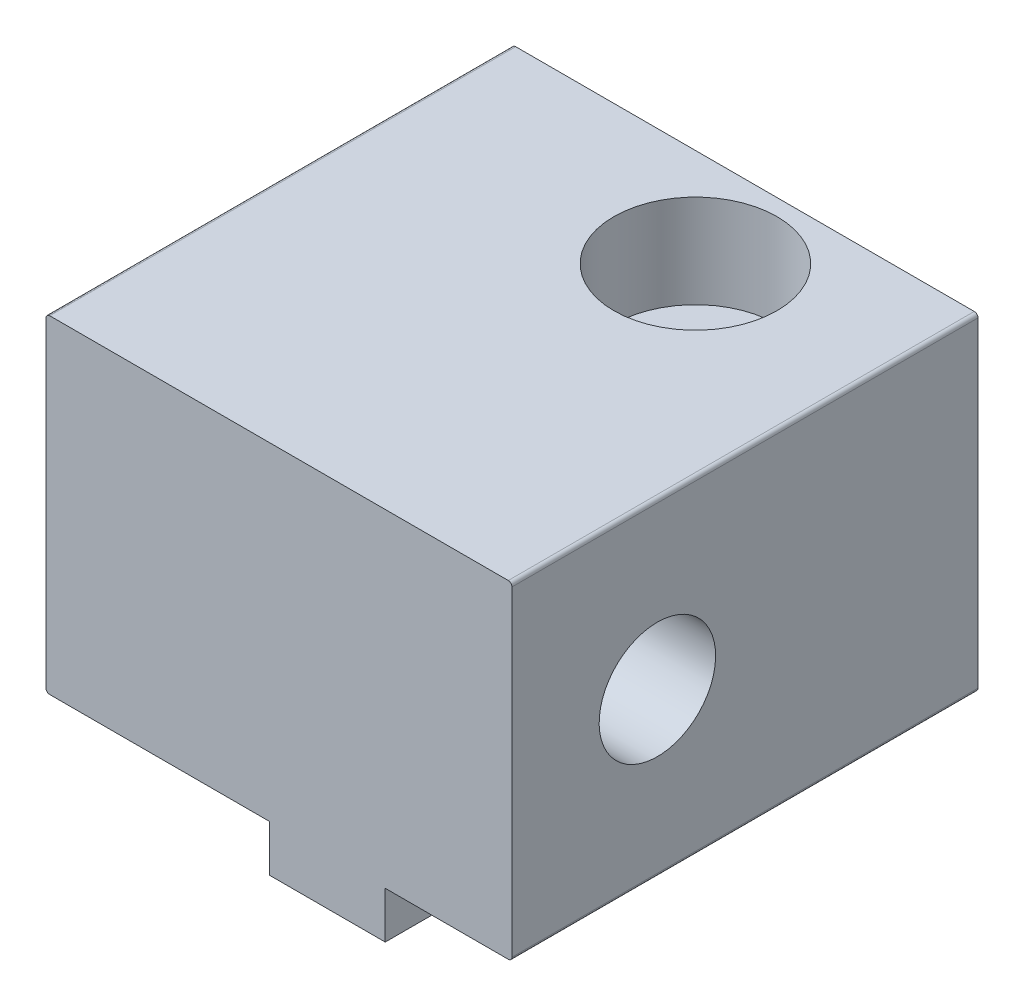
ISO-10303-21;
HEADER;
FILE_DESCRIPTION(('STEP AP214'),'2;1');
FILE_NAME('part.step','',(''),(''),'','','');
FILE_SCHEMA(('AUTOMOTIVE_DESIGN { 1 0 10303 214 1 1 1 1 }'));
ENDSEC;
DATA;
#1=APPLICATION_CONTEXT('core data for automotive mechanical design processes');
#2=APPLICATION_PROTOCOL_DEFINITION('international standard','automotive_design',2000,#1);
#3=PRODUCT_CONTEXT('',#1,'mechanical');
#4=PRODUCT('Part','Part','',(#3));
#5=PRODUCT_RELATED_PRODUCT_CATEGORY('part','',(#4));
#6=PRODUCT_DEFINITION_FORMATION('','',#4);
#7=PRODUCT_DEFINITION_CONTEXT('part definition',#1,'design');
#8=PRODUCT_DEFINITION('design','',#6,#7);
#9=PRODUCT_DEFINITION_SHAPE('','',#8);
#10=(LENGTH_UNIT() NAMED_UNIT(*) SI_UNIT(.MILLI.,.METRE.));
#11=(NAMED_UNIT(*) PLANE_ANGLE_UNIT() SI_UNIT($,.RADIAN.));
#12=(NAMED_UNIT(*) SI_UNIT($,.STERADIAN.) SOLID_ANGLE_UNIT());
#13=UNCERTAINTY_MEASURE_WITH_UNIT(LENGTH_MEASURE(1.E-05),#10,'distance_accuracy_value','');
#14=(GEOMETRIC_REPRESENTATION_CONTEXT(3) GLOBAL_UNCERTAINTY_ASSIGNED_CONTEXT((#13)) GLOBAL_UNIT_ASSIGNED_CONTEXT((#10,
#11,#12)) REPRESENTATION_CONTEXT('',''));
#15=CARTESIAN_POINT('',(0.,0.,0.));
#16=DIRECTION('',(0.,0.,1.));
#17=DIRECTION('',(1.,0.,0.));
#18=AXIS2_PLACEMENT_3D('',#15,#16,#17);
#19=CARTESIAN_POINT('',(-37.8626168224299,27.8474205607477,31.75));
#20=DIRECTION('',(1.,0.,0.));
#21=DIRECTION('',(0.,0.,-1.));
#22=AXIS2_PLACEMENT_3D('',#19,#20,#21);
#23=PLANE('',#22);
#24=CARTESIAN_POINT('',(-37.8626168224299,16.5952205607476,21.844));
#25=DIRECTION('',(1.,0.,0.));
#26=DIRECTION('',(0.,1.,0.));
#27=AXIS2_PLACEMENT_3D('',#24,#25,#26);
#28=CIRCLE('',#27,3.96875);
#29=CARTESIAN_POINT('',(-37.8626168224299,20.5639705607476,21.844));
#30=VERTEX_POINT('',#29);
#31=EDGE_CURVE('E241',#30,#30,#28,.T.);
#32=ORIENTED_EDGE('',*,*,#31,.T.);
#33=EDGE_LOOP('',(#32));
#34=FACE_BOUND('',#33,.T.);
#35=DIRECTION('',(0.,-1.,0.));
#36=VECTOR('',#35,1.);
#37=CARTESIAN_POINT('',(-37.8626168224299,27.8474205607477,0.));
#38=LINE('',#37,#36);
#39=CARTESIAN_POINT('',(-37.8626168224299,27.5934205607476,0.));
#40=VERTEX_POINT('',#39);
#41=CARTESIAN_POINT('',(-37.8626168224299,5.74942056074767,0.));
#42=VERTEX_POINT('',#41);
#43=EDGE_CURVE('E146',#40,#42,#38,.T.);
#44=ORIENTED_EDGE('',*,*,#43,.T.);
#45=DIRECTION('',(0.,0.,-1.));
#46=VECTOR('',#45,1.);
#47=CARTESIAN_POINT('',(-37.8626168224299,5.74942056074767,31.75));
#48=LINE('',#47,#46);
#49=CARTESIAN_POINT('',(-37.8626168224299,5.74942056074767,31.75));
#50=VERTEX_POINT('',#49);
#51=EDGE_CURVE('E183',#42,#50,#48,.F.);
#52=ORIENTED_EDGE('',*,*,#51,.T.);
#53=DIRECTION('',(0.,-1.,0.));
#54=VECTOR('',#53,1.);
#55=CARTESIAN_POINT('',(-37.8626168224299,27.8474205607477,31.75));
#56=LINE('',#55,#54);
#57=CARTESIAN_POINT('',(-37.8626168224299,27.5934205607476,31.75));
#58=VERTEX_POINT('',#57);
#59=EDGE_CURVE('E116',#58,#50,#56,.T.);
#60=ORIENTED_EDGE('',*,*,#59,.F.);
#61=DIRECTION('',(0.,0.,-1.));
#62=VECTOR('',#61,1.);
#63=CARTESIAN_POINT('',(-37.8626168224299,27.5934205607476,31.75));
#64=LINE('',#63,#62);
#65=EDGE_CURVE('E180',#58,#40,#64,.T.);
#66=ORIENTED_EDGE('',*,*,#65,.T.);
#67=EDGE_LOOP('',(#44,#52,#60,#66));
#68=FACE_BOUND('',#67,.T.);
#69=ADVANCED_FACE('F16',(#34,#68),#23,.F.);
#70=CARTESIAN_POINT('',(-37.8626168224299,5.49542056074766,31.75));
#71=DIRECTION('',(0.,1.,0.));
#72=DIRECTION('',(-1.,0.,0.));
#73=AXIS2_PLACEMENT_3D('',#70,#71,#72);
#74=PLANE('',#73);
#75=DIRECTION('',(1.,0.,0.));
#76=VECTOR('',#75,1.);
#77=CARTESIAN_POINT('',(-37.8626168224299,5.49542056074766,31.75));
#78=LINE('',#77,#76);
#79=CARTESIAN_POINT('',(-37.6086168224299,5.49542056074766,31.75));
#80=VERTEX_POINT('',#79);
#81=CARTESIAN_POINT('',(-22.6226168224299,5.49542056074767,31.75));
#82=VERTEX_POINT('',#81);
#83=EDGE_CURVE('E104',#80,#82,#78,.T.);
#84=ORIENTED_EDGE('',*,*,#83,.F.);
#85=DIRECTION('',(0.,0.,-1.));
#86=VECTOR('',#85,1.);
#87=CARTESIAN_POINT('',(-37.6086168224299,5.49542056074766,31.75));
#88=LINE('',#87,#86);
#89=CARTESIAN_POINT('',(-37.6086168224299,5.49542056074766,0.));
#90=VERTEX_POINT('',#89);
#91=EDGE_CURVE('E125',#80,#90,#88,.T.);
#92=ORIENTED_EDGE('',*,*,#91,.T.);
#93=DIRECTION('',(1.,0.,0.));
#94=VECTOR('',#93,1.);
#95=CARTESIAN_POINT('',(-37.8626168224299,5.49542056074766,0.));
#96=LINE('',#95,#94);
#97=CARTESIAN_POINT('',(-22.6226168224299,5.49542056074767,0.));
#98=VERTEX_POINT('',#97);
#99=EDGE_CURVE('E122',#90,#98,#96,.T.);
#100=ORIENTED_EDGE('',*,*,#99,.T.);
#101=DIRECTION('',(0.,0.,-1.));
#102=VECTOR('',#101,1.);
#103=CARTESIAN_POINT('',(-22.6226168224299,5.49542056074767,31.75));
#104=LINE('',#103,#102);
#105=EDGE_CURVE('E119',#82,#98,#104,.T.);
#106=ORIENTED_EDGE('',*,*,#105,.F.);
#107=EDGE_LOOP('',(#84,#92,#100,#106));
#108=FACE_BOUND('',#107,.T.);
#109=ADVANCED_FACE('F120',(#108),#74,.F.);
#110=CARTESIAN_POINT('',(-22.6226168224299,5.49542056074767,31.75));
#111=DIRECTION('',(1.,0.,0.));
#112=DIRECTION('',(0.,0.,-1.));
#113=AXIS2_PLACEMENT_3D('',#110,#111,#112);
#114=PLANE('',#113);
#115=DIRECTION('',(0.,-1.,0.));
#116=VECTOR('',#115,1.);
#117=CARTESIAN_POINT('',(-22.6226168224299,5.49542056074767,0.));
#118=LINE('',#117,#116);
#119=CARTESIAN_POINT('',(-22.6226168224299,2.32042056074767,0.));
#120=VERTEX_POINT('',#119);
#121=EDGE_CURVE('E151',#98,#120,#118,.T.);
#122=ORIENTED_EDGE('',*,*,#121,.T.);
#123=DIRECTION('',(0.,0.,-1.));
#124=VECTOR('',#123,1.);
#125=CARTESIAN_POINT('',(-22.6226168224299,2.32042056074767,31.75));
#126=LINE('',#125,#124);
#127=CARTESIAN_POINT('',(-22.6226168224299,2.32042056074767,31.75));
#128=VERTEX_POINT('',#127);
#129=EDGE_CURVE('E126',#128,#120,#126,.T.);
#130=ORIENTED_EDGE('',*,*,#129,.F.);
#131=DIRECTION('',(0.,-1.,0.));
#132=VECTOR('',#131,1.);
#133=CARTESIAN_POINT('',(-22.6226168224299,5.49542056074767,31.75));
#134=LINE('',#133,#132);
#135=EDGE_CURVE('E109',#82,#128,#134,.T.);
#136=ORIENTED_EDGE('',*,*,#135,.F.);
#137=ORIENTED_EDGE('',*,*,#105,.T.);
#138=EDGE_LOOP('',(#122,#130,#136,#137));
#139=FACE_BOUND('',#138,.T.);
#140=ADVANCED_FACE('F128',(#139),#114,.F.);
#141=CARTESIAN_POINT('',(-22.6226168224299,2.32042056074767,31.75));
#142=DIRECTION('',(0.,1.,0.));
#143=DIRECTION('',(0.,0.,1.));
#144=AXIS2_PLACEMENT_3D('',#141,#142,#143);
#145=PLANE('',#144);
#146=CARTESIAN_POINT('',(-18.6856168224299,2.32042056074767,6.6802));
#147=DIRECTION('',(0.,1.,0.));
#148=DIRECTION('',(0.,0.,1.));
#149=AXIS2_PLACEMENT_3D('',#146,#147,#148);
#150=CIRCLE('',#149,3.2639);
#151=CARTESIAN_POINT('',(-18.6856168224299,2.32042056074767,9.9441));
#152=VERTEX_POINT('',#151);
#153=EDGE_CURVE('E238',#152,#152,#150,.T.);
#154=ORIENTED_EDGE('',*,*,#153,.T.);
#155=EDGE_LOOP('',(#154));
#156=FACE_BOUND('',#155,.T.);
#157=DIRECTION('',(1.,0.,0.));
#158=VECTOR('',#157,1.);
#159=CARTESIAN_POINT('',(-22.6226168224299,2.32042056074767,0.));
#160=LINE('',#159,#158);
#161=CARTESIAN_POINT('',(-14.7486168224299,2.32042056074767,0.));
#162=VERTEX_POINT('',#161);
#163=EDGE_CURVE('E153',#120,#162,#160,.T.);
#164=ORIENTED_EDGE('',*,*,#163,.T.);
#165=DIRECTION('',(0.,0.,-1.));
#166=VECTOR('',#165,1.);
#167=CARTESIAN_POINT('',(-14.7486168224299,2.32042056074767,31.75));
#168=LINE('',#167,#166);
#169=CARTESIAN_POINT('',(-14.7486168224299,2.32042056074767,31.75));
#170=VERTEX_POINT('',#169);
#171=EDGE_CURVE('E167',#170,#162,#168,.T.);
#172=ORIENTED_EDGE('',*,*,#171,.F.);
#173=DIRECTION('',(1.,0.,0.));
#174=VECTOR('',#173,1.);
#175=CARTESIAN_POINT('',(-22.6226168224299,2.32042056074767,31.75));
#176=LINE('',#175,#174);
#177=EDGE_CURVE('E131',#128,#170,#176,.T.);
#178=ORIENTED_EDGE('',*,*,#177,.F.);
#179=ORIENTED_EDGE('',*,*,#129,.T.);
#180=EDGE_LOOP('',(#164,#172,#178,#179));
#181=FACE_BOUND('',#180,.T.);
#182=ADVANCED_FACE('F386',(#156,#181),#145,.F.);
#183=CARTESIAN_POINT('',(-14.7486168224299,5.49542056074767,31.75));
#184=DIRECTION('',(-1.,0.,0.));
#185=DIRECTION('',(0.,-1.,0.));
#186=AXIS2_PLACEMENT_3D('',#183,#184,#185);
#187=PLANE('',#186);
#188=DIRECTION('',(0.,1.,0.));
#189=VECTOR('',#188,1.);
#190=CARTESIAN_POINT('',(-14.7486168224299,5.49542056074767,0.));
#191=LINE('',#190,#189);
#192=CARTESIAN_POINT('',(-14.7486168224299,5.49542056074767,0.));
#193=VERTEX_POINT('',#192);
#194=EDGE_CURVE('E155',#162,#193,#191,.T.);
#195=ORIENTED_EDGE('',*,*,#194,.T.);
#196=DIRECTION('',(0.,0.,-1.));
#197=VECTOR('',#196,1.);
#198=CARTESIAN_POINT('',(-14.7486168224299,5.49542056074767,31.75));
#199=LINE('',#198,#197);
#200=CARTESIAN_POINT('',(-14.7486168224299,5.49542056074767,31.75));
#201=VERTEX_POINT('',#200);
#202=EDGE_CURVE('E145',#201,#193,#199,.T.);
#203=ORIENTED_EDGE('',*,*,#202,.F.);
#204=DIRECTION('',(0.,1.,0.));
#205=VECTOR('',#204,1.);
#206=CARTESIAN_POINT('',(-14.7486168224299,5.49542056074767,31.75));
#207=LINE('',#206,#205);
#208=EDGE_CURVE('E133',#170,#201,#207,.T.);
#209=ORIENTED_EDGE('',*,*,#208,.F.);
#210=ORIENTED_EDGE('',*,*,#171,.T.);
#211=EDGE_LOOP('',(#195,#203,#209,#210));
#212=FACE_BOUND('',#211,.T.);
#213=ADVANCED_FACE('F266',(#212),#187,.F.);
#214=CARTESIAN_POINT('',(-14.7486168224299,5.49542056074767,31.75));
#215=DIRECTION('',(0.,1.,0.));
#216=DIRECTION('',(-1.,0.,0.));
#217=AXIS2_PLACEMENT_3D('',#214,#215,#216);
#218=PLANE('',#217);
#219=DIRECTION('',(1.,0.,0.));
#220=VECTOR('',#219,1.);
#221=CARTESIAN_POINT('',(-14.7486168224299,5.49542056074767,0.));
#222=LINE('',#221,#220);
#223=CARTESIAN_POINT('',(-6.3666168224299,5.49542056074766,0.));
#224=VERTEX_POINT('',#223);
#225=EDGE_CURVE('E157',#193,#224,#222,.T.);
#226=ORIENTED_EDGE('',*,*,#225,.T.);
#227=DIRECTION('',(0.,0.,-1.));
#228=VECTOR('',#227,1.);
#229=CARTESIAN_POINT('',(-6.3666168224299,5.49542056074766,31.75));
#230=LINE('',#229,#228);
#231=CARTESIAN_POINT('',(-6.3666168224299,5.49542056074766,31.75));
#232=VERTEX_POINT('',#231);
#233=EDGE_CURVE('E196',#224,#232,#230,.F.);
#234=ORIENTED_EDGE('',*,*,#233,.T.);
#235=DIRECTION('',(1.,0.,0.));
#236=VECTOR('',#235,1.);
#237=CARTESIAN_POINT('',(-14.7486168224299,5.49542056074767,31.75));
#238=LINE('',#237,#236);
#239=EDGE_CURVE('E138',#201,#232,#238,.T.);
#240=ORIENTED_EDGE('',*,*,#239,.F.);
#241=ORIENTED_EDGE('',*,*,#202,.T.);
#242=EDGE_LOOP('',(#226,#234,#240,#241));
#243=FACE_BOUND('',#242,.T.);
#244=ADVANCED_FACE('F200',(#243),#218,.F.);
#245=CARTESIAN_POINT('',(-6.1126168224299,27.8474205607477,31.75));
#246=DIRECTION('',(-1.,0.,0.));
#247=DIRECTION('',(0.,0.,1.));
#248=AXIS2_PLACEMENT_3D('',#245,#246,#247);
#249=PLANE('',#248);
#250=CARTESIAN_POINT('',(-6.11261682242991,16.5952205607476,21.844));
#251=DIRECTION('',(1.,0.,0.));
#252=DIRECTION('',(0.,1.,0.));
#253=AXIS2_PLACEMENT_3D('',#250,#251,#252);
#254=CIRCLE('',#253,3.96875);
#255=CARTESIAN_POINT('',(-6.11261682242991,20.5639705607476,21.844));
#256=VERTEX_POINT('',#255);
#257=EDGE_CURVE('E242',#256,#256,#254,.T.);
#258=ORIENTED_EDGE('',*,*,#257,.F.);
#259=EDGE_LOOP('',(#258));
#260=FACE_BOUND('',#259,.T.);
#261=DIRECTION('',(0.,1.,0.));
#262=VECTOR('',#261,1.);
#263=CARTESIAN_POINT('',(-6.1126168224299,27.8474205607477,31.75));
#264=LINE('',#263,#262);
#265=CARTESIAN_POINT('',(-6.1126168224299,5.74942056074767,31.75));
#266=VERTEX_POINT('',#265);
#267=CARTESIAN_POINT('',(-6.1126168224299,27.5934205607476,31.75));
#268=VERTEX_POINT('',#267);
#269=EDGE_CURVE('E141',#266,#268,#264,.T.);
#270=ORIENTED_EDGE('',*,*,#269,.F.);
#271=DIRECTION('',(0.,0.,-1.));
#272=VECTOR('',#271,1.);
#273=CARTESIAN_POINT('',(-6.1126168224299,5.74942056074767,31.75));
#274=LINE('',#273,#272);
#275=CARTESIAN_POINT('',(-6.1126168224299,5.74942056074767,0.));
#276=VERTEX_POINT('',#275);
#277=EDGE_CURVE('E193',#266,#276,#274,.T.);
#278=ORIENTED_EDGE('',*,*,#277,.T.);
#279=DIRECTION('',(0.,1.,0.));
#280=VECTOR('',#279,1.);
#281=CARTESIAN_POINT('',(-6.1126168224299,27.8474205607477,0.));
#282=LINE('',#281,#280);
#283=CARTESIAN_POINT('',(-6.1126168224299,27.5934205607476,0.));
#284=VERTEX_POINT('',#283);
#285=EDGE_CURVE('E160',#276,#284,#282,.T.);
#286=ORIENTED_EDGE('',*,*,#285,.T.);
#287=DIRECTION('',(0.,0.,-1.));
#288=VECTOR('',#287,1.);
#289=CARTESIAN_POINT('',(-6.1126168224299,27.5934205607476,31.75));
#290=LINE('',#289,#288);
#291=EDGE_CURVE('E191',#284,#268,#290,.F.);
#292=ORIENTED_EDGE('',*,*,#291,.T.);
#293=EDGE_LOOP('',(#270,#278,#286,#292));
#294=FACE_BOUND('',#293,.T.);
#295=ADVANCED_FACE('F211',(#260,#294),#249,.F.);
#296=CARTESIAN_POINT('',(-37.8626168224299,27.8474205607477,31.75));
#297=DIRECTION('',(0.,-1.,0.));
#298=DIRECTION('',(0.,0.,-1.));
#299=AXIS2_PLACEMENT_3D('',#296,#297,#298);
#300=PLANE('',#299);
#301=CARTESIAN_POINT('',(-18.6856168224299,27.8474205607477,6.6802));
#302=DIRECTION('',(0.,1.,0.));
#303=DIRECTION('',(0.,0.,1.));
#304=AXIS2_PLACEMENT_3D('',#301,#302,#303);
#305=CIRCLE('',#304,5.55625);
#306=CARTESIAN_POINT('',(-18.6856168224299,27.8474205607477,12.23645));
#307=VERTEX_POINT('',#306);
#308=EDGE_CURVE('E149',#307,#307,#305,.T.);
#309=ORIENTED_EDGE('',*,*,#308,.F.);
#310=EDGE_LOOP('',(#309));
#311=FACE_BOUND('',#310,.T.);
#312=DIRECTION('',(-1.,0.,0.));
#313=VECTOR('',#312,1.);
#314=CARTESIAN_POINT('',(-37.8626168224299,27.8474205607477,31.75));
#315=LINE('',#314,#313);
#316=CARTESIAN_POINT('',(-6.3666168224299,27.8474205607477,31.75));
#317=VERTEX_POINT('',#316);
#318=CARTESIAN_POINT('',(-37.6086168224299,27.8474205607477,31.75));
#319=VERTEX_POINT('',#318);
#320=EDGE_CURVE('E143',#317,#319,#315,.T.);
#321=ORIENTED_EDGE('',*,*,#320,.F.);
#322=DIRECTION('',(0.,0.,-1.));
#323=VECTOR('',#322,1.);
#324=CARTESIAN_POINT('',(-6.3666168224299,27.8474205607477,31.75));
#325=LINE('',#324,#323);
#326=CARTESIAN_POINT('',(-6.3666168224299,27.8474205607477,0.));
#327=VERTEX_POINT('',#326);
#328=EDGE_CURVE('E10',#317,#327,#325,.T.);
#329=ORIENTED_EDGE('',*,*,#328,.T.);
#330=DIRECTION('',(-1.,0.,0.));
#331=VECTOR('',#330,1.);
#332=CARTESIAN_POINT('',(-37.8626168224299,27.8474205607477,0.));
#333=LINE('',#332,#331);
#334=CARTESIAN_POINT('',(-37.6086168224299,27.8474205607477,0.));
#335=VERTEX_POINT('',#334);
#336=EDGE_CURVE('E163',#327,#335,#333,.T.);
#337=ORIENTED_EDGE('',*,*,#336,.T.);
#338=DIRECTION('',(0.,0.,-1.));
#339=VECTOR('',#338,1.);
#340=CARTESIAN_POINT('',(-37.6086168224299,27.8474205607477,31.75));
#341=LINE('',#340,#339);
#342=EDGE_CURVE('E24',#335,#319,#341,.F.);
#343=ORIENTED_EDGE('',*,*,#342,.T.);
#344=EDGE_LOOP('',(#321,#329,#337,#343));
#345=FACE_BOUND('',#344,.T.);
#346=ADVANCED_FACE('F219',(#311,#345),#300,.F.);
#347=CARTESIAN_POINT('',(-37.8626168224299,2.32042056074767,31.75));
#348=DIRECTION('',(0.,0.,1.));
#349=DIRECTION('',(1.,0.,0.));
#350=AXIS2_PLACEMENT_3D('',#347,#348,#349);
#351=PLANE('',#350);
#352=ORIENTED_EDGE('',*,*,#59,.T.);
#353=CARTESIAN_POINT('',(-37.6086168224299,5.74942056074766,31.75));
#354=DIRECTION('',(0.,0.,1.));
#355=DIRECTION('',(1.,0.,0.));
#356=AXIS2_PLACEMENT_3D('',#353,#354,#355);
#357=CIRCLE('',#356,0.254);
#358=EDGE_CURVE('E112',#50,#80,#357,.T.);
#359=ORIENTED_EDGE('',*,*,#358,.T.);
#360=ORIENTED_EDGE('',*,*,#83,.T.);
#361=ORIENTED_EDGE('',*,*,#135,.T.);
#362=ORIENTED_EDGE('',*,*,#177,.T.);
#363=ORIENTED_EDGE('',*,*,#208,.T.);
#364=ORIENTED_EDGE('',*,*,#239,.T.);
#365=CARTESIAN_POINT('',(-6.3666168224299,5.74942056074767,31.75));
#366=DIRECTION('',(0.,0.,1.));
#367=DIRECTION('',(1.,0.,0.));
#368=AXIS2_PLACEMENT_3D('',#365,#366,#367);
#369=CIRCLE('',#368,0.254);
#370=EDGE_CURVE('E188',#232,#266,#369,.T.);
#371=ORIENTED_EDGE('',*,*,#370,.T.);
#372=ORIENTED_EDGE('',*,*,#269,.T.);
#373=CARTESIAN_POINT('',(-6.3666168224299,27.5934205607476,31.75));
#374=DIRECTION('',(0.,0.,1.));
#375=DIRECTION('',(1.,0.,0.));
#376=AXIS2_PLACEMENT_3D('',#373,#374,#375);
#377=CIRCLE('',#376,0.254);
#378=EDGE_CURVE('E37',#268,#317,#377,.T.);
#379=ORIENTED_EDGE('',*,*,#378,.T.);
#380=ORIENTED_EDGE('',*,*,#320,.T.);
#381=CARTESIAN_POINT('',(-37.6086168224299,27.5934205607476,31.75));
#382=DIRECTION('',(0.,0.,1.));
#383=DIRECTION('',(1.,0.,0.));
#384=AXIS2_PLACEMENT_3D('',#381,#382,#383);
#385=CIRCLE('',#384,0.254);
#386=EDGE_CURVE('E185',#319,#58,#385,.T.);
#387=ORIENTED_EDGE('',*,*,#386,.T.);
#388=EDGE_LOOP('',(#352,#359,#360,#361,#362,#363,#364,#371,#372,#379,#380,#387));
#389=FACE_BOUND('',#388,.T.);
#390=ADVANCED_FACE('F107',(#389),#351,.T.);
#391=CARTESIAN_POINT('',(-37.8626168224299,2.32042056074767,0.));
#392=DIRECTION('',(0.,0.,1.));
#393=DIRECTION('',(1.,0.,0.));
#394=AXIS2_PLACEMENT_3D('',#391,#392,#393);
#395=PLANE('',#394);
#396=ORIENTED_EDGE('',*,*,#99,.F.);
#397=CARTESIAN_POINT('',(-37.6086168224299,5.74942056074766,0.));
#398=DIRECTION('',(0.,0.,1.));
#399=DIRECTION('',(1.,0.,0.));
#400=AXIS2_PLACEMENT_3D('',#397,#398,#399);
#401=CIRCLE('',#400,0.254);
#402=EDGE_CURVE('E178',#90,#42,#401,.F.);
#403=ORIENTED_EDGE('',*,*,#402,.T.);
#404=ORIENTED_EDGE('',*,*,#43,.F.);
#405=CARTESIAN_POINT('',(-37.6086168224299,27.5934205607476,0.));
#406=DIRECTION('',(0.,0.,1.));
#407=DIRECTION('',(1.,0.,0.));
#408=AXIS2_PLACEMENT_3D('',#405,#406,#407);
#409=CIRCLE('',#408,0.254);
#410=EDGE_CURVE('E172',#40,#335,#409,.F.);
#411=ORIENTED_EDGE('',*,*,#410,.T.);
#412=ORIENTED_EDGE('',*,*,#336,.F.);
#413=CARTESIAN_POINT('',(-6.3666168224299,27.5934205607476,0.));
#414=DIRECTION('',(0.,0.,1.));
#415=DIRECTION('',(1.,0.,0.));
#416=AXIS2_PLACEMENT_3D('',#413,#414,#415);
#417=CIRCLE('',#416,0.254);
#418=EDGE_CURVE('E174',#327,#284,#417,.F.);
#419=ORIENTED_EDGE('',*,*,#418,.T.);
#420=ORIENTED_EDGE('',*,*,#285,.F.);
#421=CARTESIAN_POINT('',(-6.3666168224299,5.74942056074767,0.));
#422=DIRECTION('',(0.,0.,1.));
#423=DIRECTION('',(1.,0.,0.));
#424=AXIS2_PLACEMENT_3D('',#421,#422,#423);
#425=CIRCLE('',#424,0.254);
#426=EDGE_CURVE('E176',#276,#224,#425,.F.);
#427=ORIENTED_EDGE('',*,*,#426,.T.);
#428=ORIENTED_EDGE('',*,*,#225,.F.);
#429=ORIENTED_EDGE('',*,*,#194,.F.);
#430=ORIENTED_EDGE('',*,*,#163,.F.);
#431=ORIENTED_EDGE('',*,*,#121,.F.);
#432=EDGE_LOOP('',(#396,#403,#404,#411,#412,#419,#420,#427,#428,#429,#430,#431));
#433=FACE_BOUND('',#432,.T.);
#434=ADVANCED_FACE('F214',(#433),#395,.F.);
#435=CARTESIAN_POINT('',(-18.6856168224299,27.8474205607477,6.6802));
#436=DIRECTION('',(0.,1.,0.));
#437=DIRECTION('',(0.,0.,1.));
#438=AXIS2_PLACEMENT_3D('',#435,#436,#437);
#439=CYLINDRICAL_SURFACE('',#438,5.55625);
#440=CARTESIAN_POINT('',(-18.6856168224299,21.4974205607476,6.6802));
#441=DIRECTION('',(0.,1.,0.));
#442=DIRECTION('',(0.,0.,1.));
#443=AXIS2_PLACEMENT_3D('',#440,#441,#442);
#444=CIRCLE('',#443,5.55625);
#445=CARTESIAN_POINT('',(-18.6856168224299,21.4974205607476,12.23645));
#446=VERTEX_POINT('',#445);
#447=EDGE_CURVE('E232',#446,#446,#444,.T.);
#448=ORIENTED_EDGE('',*,*,#447,.F.);
#449=EDGE_LOOP('',(#448));
#450=FACE_BOUND('',#449,.T.);
#451=ORIENTED_EDGE('',*,*,#308,.T.);
#452=EDGE_LOOP('',(#451));
#453=FACE_BOUND('',#452,.T.);
#454=ADVANCED_FACE('F334',(#450,#453),#439,.F.);
#455=CARTESIAN_POINT('',(-15.4217168224299,21.4974205607476,6.6802));
#456=DIRECTION('',(0.,-1.,0.));
#457=DIRECTION('',(0.,0.,-1.));
#458=AXIS2_PLACEMENT_3D('',#455,#456,#457);
#459=PLANE('',#458);
#460=CARTESIAN_POINT('',(-18.6856168224299,21.4974205607476,6.6802));
#461=DIRECTION('',(0.,1.,0.));
#462=DIRECTION('',(0.,0.,1.));
#463=AXIS2_PLACEMENT_3D('',#460,#461,#462);
#464=CIRCLE('',#463,3.2639);
#465=CARTESIAN_POINT('',(-18.6856168224299,21.4974205607476,9.9441));
#466=VERTEX_POINT('',#465);
#467=EDGE_CURVE('E235',#466,#466,#464,.T.);
#468=ORIENTED_EDGE('',*,*,#467,.F.);
#469=EDGE_LOOP('',(#468));
#470=FACE_BOUND('',#469,.T.);
#471=ORIENTED_EDGE('',*,*,#447,.T.);
#472=EDGE_LOOP('',(#471));
#473=FACE_BOUND('',#472,.T.);
#474=ADVANCED_FACE('F324',(#470,#473),#459,.F.);
#475=CARTESIAN_POINT('',(-18.6856168224299,27.8474205607477,6.6802));
#476=DIRECTION('',(0.,1.,0.));
#477=DIRECTION('',(0.,0.,1.));
#478=AXIS2_PLACEMENT_3D('',#475,#476,#477);
#479=CYLINDRICAL_SURFACE('',#478,3.2639);
#480=ORIENTED_EDGE('',*,*,#153,.F.);
#481=EDGE_LOOP('',(#480));
#482=FACE_BOUND('',#481,.T.);
#483=ORIENTED_EDGE('',*,*,#467,.T.);
#484=EDGE_LOOP('',(#483));
#485=FACE_BOUND('',#484,.T.);
#486=ADVANCED_FACE('F252',(#482,#485),#479,.F.);
#487=CARTESIAN_POINT('',(-37.8626168224299,16.5952205607476,21.844));
#488=DIRECTION('',(1.,0.,0.));
#489=DIRECTION('',(0.,1.,0.));
#490=AXIS2_PLACEMENT_3D('',#487,#488,#489);
#491=CYLINDRICAL_SURFACE('',#490,3.96875);
#492=ORIENTED_EDGE('',*,*,#31,.F.);
#493=EDGE_LOOP('',(#492));
#494=FACE_BOUND('',#493,.T.);
#495=ORIENTED_EDGE('',*,*,#257,.T.);
#496=EDGE_LOOP('',(#495));
#497=FACE_BOUND('',#496,.T.);
#498=ADVANCED_FACE('F249',(#494,#497),#491,.F.);
#499=CARTESIAN_POINT('',(-37.6086168224299,5.74942056074766,31.75));
#500=DIRECTION('',(0.,0.,-1.));
#501=DIRECTION('',(-1.,0.,0.));
#502=AXIS2_PLACEMENT_3D('',#499,#500,#501);
#503=CYLINDRICAL_SURFACE('',#502,0.254);
#504=ORIENTED_EDGE('',*,*,#358,.F.);
#505=ORIENTED_EDGE('',*,*,#51,.F.);
#506=ORIENTED_EDGE('',*,*,#402,.F.);
#507=ORIENTED_EDGE('',*,*,#91,.F.);
#508=EDGE_LOOP('',(#504,#505,#506,#507));
#509=FACE_BOUND('',#508,.T.);
#510=ADVANCED_FACE('F228',(#509),#503,.T.);
#511=CARTESIAN_POINT('',(-6.3666168224299,5.74942056074767,31.75));
#512=DIRECTION('',(0.,0.,-1.));
#513=DIRECTION('',(-1.,0.,0.));
#514=AXIS2_PLACEMENT_3D('',#511,#512,#513);
#515=CYLINDRICAL_SURFACE('',#514,0.254);
#516=ORIENTED_EDGE('',*,*,#370,.F.);
#517=ORIENTED_EDGE('',*,*,#233,.F.);
#518=ORIENTED_EDGE('',*,*,#426,.F.);
#519=ORIENTED_EDGE('',*,*,#277,.F.);
#520=EDGE_LOOP('',(#516,#517,#518,#519));
#521=FACE_BOUND('',#520,.T.);
#522=ADVANCED_FACE('F208',(#521),#515,.T.);
#523=CARTESIAN_POINT('',(-6.3666168224299,27.5934205607476,31.75));
#524=DIRECTION('',(0.,0.,-1.));
#525=DIRECTION('',(-1.,0.,0.));
#526=AXIS2_PLACEMENT_3D('',#523,#524,#525);
#527=CYLINDRICAL_SURFACE('',#526,0.254);
#528=ORIENTED_EDGE('',*,*,#378,.F.);
#529=ORIENTED_EDGE('',*,*,#291,.F.);
#530=ORIENTED_EDGE('',*,*,#418,.F.);
#531=ORIENTED_EDGE('',*,*,#328,.F.);
#532=EDGE_LOOP('',(#528,#529,#530,#531));
#533=FACE_BOUND('',#532,.T.);
#534=ADVANCED_FACE('F218',(#533),#527,.T.);
#535=CARTESIAN_POINT('',(-37.6086168224299,27.5934205607476,31.75));
#536=DIRECTION('',(0.,0.,-1.));
#537=DIRECTION('',(-1.,0.,0.));
#538=AXIS2_PLACEMENT_3D('',#535,#536,#537);
#539=CYLINDRICAL_SURFACE('',#538,0.254);
#540=ORIENTED_EDGE('',*,*,#386,.F.);
#541=ORIENTED_EDGE('',*,*,#342,.F.);
#542=ORIENTED_EDGE('',*,*,#410,.F.);
#543=ORIENTED_EDGE('',*,*,#65,.F.);
#544=EDGE_LOOP('',(#540,#541,#542,#543));
#545=FACE_BOUND('',#544,.T.);
#546=ADVANCED_FACE('F18',(#545),#539,.T.);
#547=CLOSED_SHELL('',(#69,#109,#140,#182,#213,#244,#295,#346,#390,#434,#454,#474,#486,#498,#510,
#522,#534,#546));
#548=MANIFOLD_SOLID_BREP('B1',#547);
#549=ADVANCED_BREP_SHAPE_REPRESENTATION('',(#18,#548),#14);
#550=SHAPE_DEFINITION_REPRESENTATION(#9,#549);
ENDSEC;
END-ISO-10303-21;
